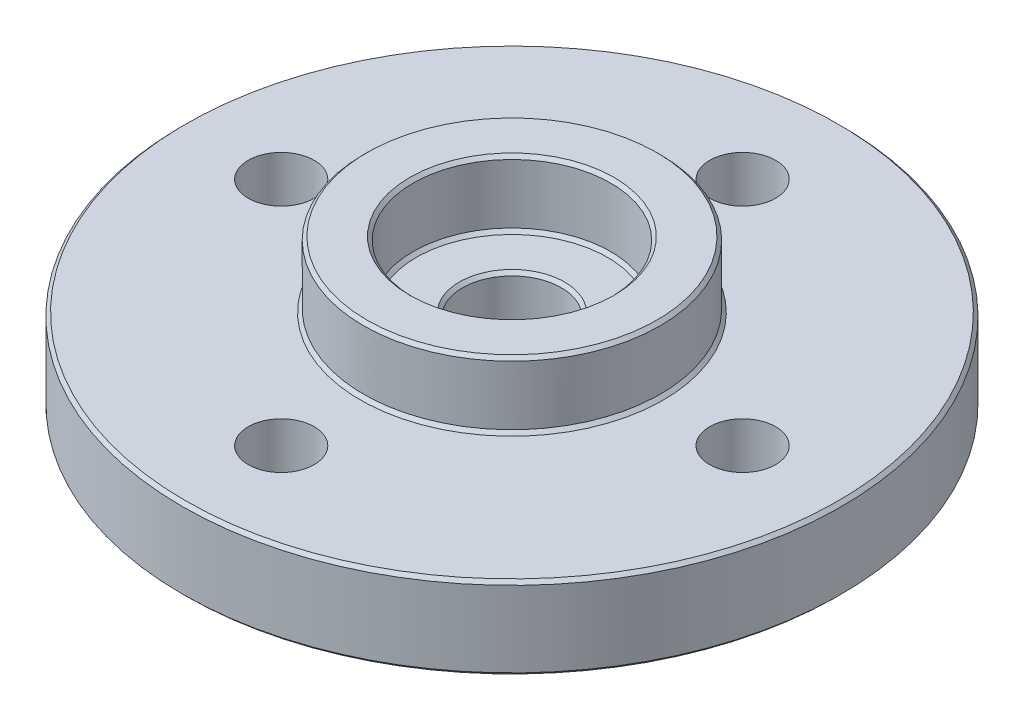
ISO-10303-21;
HEADER;
FILE_DESCRIPTION(('STEP AP214'),'2;1');
FILE_NAME('part.step','',(''),(''),'','','');
FILE_SCHEMA(('AUTOMOTIVE_DESIGN { 1 0 10303 214 1 1 1 1 }'));
ENDSEC;
DATA;
#1=APPLICATION_CONTEXT('core data for automotive mechanical design processes');
#2=APPLICATION_PROTOCOL_DEFINITION('international standard','automotive_design',2000,#1);
#3=PRODUCT_CONTEXT('',#1,'mechanical');
#4=PRODUCT('Part','Part','',(#3));
#5=PRODUCT_RELATED_PRODUCT_CATEGORY('part','',(#4));
#6=PRODUCT_DEFINITION_FORMATION('','',#4);
#7=PRODUCT_DEFINITION_CONTEXT('part definition',#1,'design');
#8=PRODUCT_DEFINITION('design','',#6,#7);
#9=PRODUCT_DEFINITION_SHAPE('','',#8);
#10=(LENGTH_UNIT() NAMED_UNIT(*) SI_UNIT(.MILLI.,.METRE.));
#11=(NAMED_UNIT(*) PLANE_ANGLE_UNIT() SI_UNIT($,.RADIAN.));
#12=(NAMED_UNIT(*) SI_UNIT($,.STERADIAN.) SOLID_ANGLE_UNIT());
#13=UNCERTAINTY_MEASURE_WITH_UNIT(LENGTH_MEASURE(1.E-05),#10,'distance_accuracy_value','');
#14=(GEOMETRIC_REPRESENTATION_CONTEXT(3) GLOBAL_UNCERTAINTY_ASSIGNED_CONTEXT((#13)) GLOBAL_UNIT_ASSIGNED_CONTEXT((#10,
#11,#12)) REPRESENTATION_CONTEXT('',''));
#15=CARTESIAN_POINT('',(0.,0.,0.));
#16=DIRECTION('',(0.,0.,1.));
#17=DIRECTION('',(1.,0.,0.));
#18=AXIS2_PLACEMENT_3D('',#15,#16,#17);
#19=CARTESIAN_POINT('',(0.,2.5,0.));
#20=DIRECTION('',(0.,1.,0.));
#21=DIRECTION('',(0.,0.,1.));
#22=AXIS2_PLACEMENT_3D('',#19,#20,#21);
#23=PLANE('',#22);
#24=CARTESIAN_POINT('',(0.,2.5,0.));
#25=DIRECTION('',(0.,1.,0.));
#26=DIRECTION('',(0.,0.,1.));
#27=AXIS2_PLACEMENT_3D('',#24,#25,#26);
#28=CIRCLE('',#27,1.6);
#29=CARTESIAN_POINT('',(0.,2.5,1.6));
#30=VERTEX_POINT('',#29);
#31=EDGE_CURVE('E56',#30,#30,#28,.F.);
#32=ORIENTED_EDGE('',*,*,#31,.T.);
#33=EDGE_LOOP('',(#32));
#34=FACE_BOUND('',#33,.T.);
#35=CARTESIAN_POINT('',(0.,2.5,0.));
#36=DIRECTION('',(0.,1.,0.));
#37=DIRECTION('',(0.,0.,1.));
#38=AXIS2_PLACEMENT_3D('',#35,#36,#37);
#39=CIRCLE('',#38,2.89999999999999);
#40=CARTESIAN_POINT('',(0.,2.5,2.89999999999999));
#41=VERTEX_POINT('',#40);
#42=EDGE_CURVE('E61',#41,#41,#39,.T.);
#43=ORIENTED_EDGE('',*,*,#42,.T.);
#44=EDGE_LOOP('',(#43));
#45=FACE_BOUND('',#44,.T.);
#46=ADVANCED_FACE('F40',(#34,#45),#23,.T.);
#47=CARTESIAN_POINT('',(0.,2.5,0.));
#48=DIRECTION('',(0.,1.,0.));
#49=DIRECTION('',(0.,0.,1.));
#50=AXIS2_PLACEMENT_3D('',#47,#48,#49);
#51=CIRCLE('',#50,9.89999999999999);
#52=CARTESIAN_POINT('',(0.,2.5,9.89999999999999));
#53=VERTEX_POINT('',#52);
#54=EDGE_CURVE('E70',#53,#53,#51,.T.);
#55=ORIENTED_EDGE('',*,*,#54,.T.);
#56=EDGE_LOOP('',(#55));
#57=FACE_BOUND('',#56,.T.);
#58=CARTESIAN_POINT('',(0.,2.5,0.));
#59=DIRECTION('',(0.,1.,0.));
#60=DIRECTION('',(0.,0.,1.));
#61=AXIS2_PLACEMENT_3D('',#58,#59,#60);
#62=CIRCLE('',#61,4.59999999999999);
#63=CARTESIAN_POINT('',(0.,2.5,-4.59999999999999));
#64=VERTEX_POINT('',#63);
#65=EDGE_CURVE('E73',#64,#64,#62,.F.);
#66=ORIENTED_EDGE('',*,*,#65,.T.);
#67=EDGE_LOOP('',(#66));
#68=FACE_BOUND('',#67,.T.);
#69=CARTESIAN_POINT('',(3.95332173747447E-13,2.5,7.));
#70=DIRECTION('',(0.,1.,0.));
#71=DIRECTION('',(0.,0.,1.));
#72=AXIS2_PLACEMENT_3D('',#69,#70,#71);
#73=CIRCLE('',#72,1.);
#74=CARTESIAN_POINT('',(3.95332173747447E-13,2.5,8.));
#75=VERTEX_POINT('',#74);
#76=EDGE_CURVE('E104',#75,#75,#73,.T.);
#77=ORIENTED_EDGE('',*,*,#76,.F.);
#78=EDGE_LOOP('',(#77));
#79=FACE_BOUND('',#78,.T.);
#80=CARTESIAN_POINT('',(0.,2.5,-7.));
#81=DIRECTION('',(0.,1.,0.));
#82=DIRECTION('',(0.,0.,1.));
#83=AXIS2_PLACEMENT_3D('',#80,#81,#82);
#84=CIRCLE('',#83,1.);
#85=CARTESIAN_POINT('',(0.,2.5,-6.));
#86=VERTEX_POINT('',#85);
#87=EDGE_CURVE('E94',#86,#86,#84,.T.);
#88=ORIENTED_EDGE('',*,*,#87,.F.);
#89=EDGE_LOOP('',(#88));
#90=FACE_BOUND('',#89,.T.);
#91=CARTESIAN_POINT('',(7.0000000000002,2.5,-1.97666086873723E-13));
#92=DIRECTION('',(0.,1.,0.));
#93=DIRECTION('',(0.,0.,1.));
#94=AXIS2_PLACEMENT_3D('',#91,#92,#93);
#95=CIRCLE('',#94,1.);
#96=CARTESIAN_POINT('',(7.0000000000002,2.5,0.999999999999803));
#97=VERTEX_POINT('',#96);
#98=EDGE_CURVE('E98',#97,#97,#95,.T.);
#99=ORIENTED_EDGE('',*,*,#98,.F.);
#100=EDGE_LOOP('',(#99));
#101=FACE_BOUND('',#100,.T.);
#102=CARTESIAN_POINT('',(-6.9999999999998,2.5,1.98523339633126E-13));
#103=DIRECTION('',(0.,1.,0.));
#104=DIRECTION('',(0.,0.,1.));
#105=AXIS2_PLACEMENT_3D('',#102,#103,#104);
#106=CIRCLE('',#105,1.);
#107=CARTESIAN_POINT('',(-6.9999999999998,2.5,1.0000000000002));
#108=VERTEX_POINT('',#107);
#109=EDGE_CURVE('E110',#108,#108,#106,.T.);
#110=ORIENTED_EDGE('',*,*,#109,.F.);
#111=EDGE_LOOP('',(#110));
#112=FACE_BOUND('',#111,.T.);
#113=ADVANCED_FACE('F122',(#57,#68,#79,#90,#101,#112),#23,.T.);
#114=CARTESIAN_POINT('',(0.,0.,0.));
#115=DIRECTION('',(0.,1.,0.));
#116=DIRECTION('',(0.,0.,1.));
#117=AXIS2_PLACEMENT_3D('',#114,#115,#116);
#118=PLANE('',#117);
#119=CARTESIAN_POINT('',(0.,0.,0.));
#120=DIRECTION('',(0.,1.,0.));
#121=DIRECTION('',(0.,0.,1.));
#122=AXIS2_PLACEMENT_3D('',#119,#120,#121);
#123=CIRCLE('',#122,9.9);
#124=CARTESIAN_POINT('',(0.,0.,9.9));
#125=VERTEX_POINT('',#124);
#126=EDGE_CURVE('E76',#125,#125,#123,.F.);
#127=ORIENTED_EDGE('',*,*,#126,.T.);
#128=EDGE_LOOP('',(#127));
#129=FACE_BOUND('',#128,.T.);
#130=CARTESIAN_POINT('',(0.,0.,0.));
#131=DIRECTION('',(0.,1.,0.));
#132=DIRECTION('',(0.,0.,1.));
#133=AXIS2_PLACEMENT_3D('',#130,#131,#132);
#134=CIRCLE('',#133,1.5);
#135=CARTESIAN_POINT('',(0.,0.,1.5));
#136=VERTEX_POINT('',#135);
#137=EDGE_CURVE('E91',#136,#136,#134,.T.);
#138=ORIENTED_EDGE('',*,*,#137,.T.);
#139=EDGE_LOOP('',(#138));
#140=FACE_BOUND('',#139,.T.);
#141=CARTESIAN_POINT('',(0.,0.,-7.));
#142=DIRECTION('',(0.,1.,0.));
#143=DIRECTION('',(0.,0.,1.));
#144=AXIS2_PLACEMENT_3D('',#141,#142,#143);
#145=CIRCLE('',#144,1.);
#146=CARTESIAN_POINT('',(0.,0.,-6.));
#147=VERTEX_POINT('',#146);
#148=EDGE_CURVE('E95',#147,#147,#145,.T.);
#149=ORIENTED_EDGE('',*,*,#148,.T.);
#150=EDGE_LOOP('',(#149));
#151=FACE_BOUND('',#150,.T.);
#152=CARTESIAN_POINT('',(7.0000000000002,0.,-1.97666086873723E-13));
#153=DIRECTION('',(0.,1.,0.));
#154=DIRECTION('',(0.,0.,1.));
#155=AXIS2_PLACEMENT_3D('',#152,#153,#154);
#156=CIRCLE('',#155,1.);
#157=CARTESIAN_POINT('',(7.0000000000002,0.,0.999999999999803));
#158=VERTEX_POINT('',#157);
#159=EDGE_CURVE('E101',#158,#158,#156,.T.);
#160=ORIENTED_EDGE('',*,*,#159,.T.);
#161=EDGE_LOOP('',(#160));
#162=FACE_BOUND('',#161,.T.);
#163=CARTESIAN_POINT('',(3.95332173747447E-13,0.,7.));
#164=DIRECTION('',(0.,1.,0.));
#165=DIRECTION('',(0.,0.,1.));
#166=AXIS2_PLACEMENT_3D('',#163,#164,#165);
#167=CIRCLE('',#166,1.);
#168=CARTESIAN_POINT('',(3.95332173747447E-13,0.,8.));
#169=VERTEX_POINT('',#168);
#170=EDGE_CURVE('E107',#169,#169,#167,.T.);
#171=ORIENTED_EDGE('',*,*,#170,.T.);
#172=EDGE_LOOP('',(#171));
#173=FACE_BOUND('',#172,.T.);
#174=CARTESIAN_POINT('',(-6.9999999999998,0.,1.98523339633126E-13));
#175=DIRECTION('',(0.,1.,0.));
#176=DIRECTION('',(0.,0.,1.));
#177=AXIS2_PLACEMENT_3D('',#174,#175,#176);
#178=CIRCLE('',#177,1.);
#179=CARTESIAN_POINT('',(-6.9999999999998,0.,1.0000000000002));
#180=VERTEX_POINT('',#179);
#181=EDGE_CURVE('E113',#180,#180,#178,.T.);
#182=ORIENTED_EDGE('',*,*,#181,.T.);
#183=EDGE_LOOP('',(#182));
#184=FACE_BOUND('',#183,.T.);
#185=ADVANCED_FACE('F124',(#129,#140,#151,#162,#173,#184),#118,.F.);
#186=CARTESIAN_POINT('',(0.,2.5,0.));
#187=DIRECTION('',(0.,-1.,0.));
#188=DIRECTION('',(0.,0.,-1.));
#189=AXIS2_PLACEMENT_3D('',#186,#187,#188);
#190=CYLINDRICAL_SURFACE('',#189,9.99999999999999);
#191=CARTESIAN_POINT('',(0.,0.0999999999999959,0.));
#192=DIRECTION('',(0.,1.,0.));
#193=DIRECTION('',(0.,0.,1.));
#194=AXIS2_PLACEMENT_3D('',#191,#192,#193);
#195=CIRCLE('',#194,9.99999999999999);
#196=CARTESIAN_POINT('',(0.,0.0999999999999959,9.99999999999999));
#197=VERTEX_POINT('',#196);
#198=EDGE_CURVE('E79',#197,#197,#195,.T.);
#199=ORIENTED_EDGE('',*,*,#198,.T.);
#200=EDGE_LOOP('',(#199));
#201=FACE_BOUND('',#200,.T.);
#202=CARTESIAN_POINT('',(0.,2.4,0.));
#203=DIRECTION('',(0.,1.,0.));
#204=DIRECTION('',(0.,0.,1.));
#205=AXIS2_PLACEMENT_3D('',#202,#203,#204);
#206=CIRCLE('',#205,9.99999999999999);
#207=CARTESIAN_POINT('',(0.,2.4,9.99999999999999));
#208=VERTEX_POINT('',#207);
#209=EDGE_CURVE('E82',#208,#208,#206,.F.);
#210=ORIENTED_EDGE('',*,*,#209,.T.);
#211=EDGE_LOOP('',(#210));
#212=FACE_BOUND('',#211,.T.);
#213=ADVANCED_FACE('F131',(#201,#212),#190,.T.);
#214=CARTESIAN_POINT('',(0.,2.5,0.));
#215=DIRECTION('',(0.,-1.,0.));
#216=DIRECTION('',(0.,0.,-1.));
#217=AXIS2_PLACEMENT_3D('',#214,#215,#216);
#218=CYLINDRICAL_SURFACE('',#217,1.5);
#219=CARTESIAN_POINT('',(0.,2.4,0.));
#220=DIRECTION('',(0.,1.,0.));
#221=DIRECTION('',(0.,0.,1.));
#222=AXIS2_PLACEMENT_3D('',#219,#220,#221);
#223=CIRCLE('',#222,1.5);
#224=CARTESIAN_POINT('',(0.,2.4,1.5));
#225=VERTEX_POINT('',#224);
#226=EDGE_CURVE('E64',#225,#225,#223,.T.);
#227=ORIENTED_EDGE('',*,*,#226,.T.);
#228=EDGE_LOOP('',(#227));
#229=FACE_BOUND('',#228,.T.);
#230=ORIENTED_EDGE('',*,*,#137,.F.);
#231=EDGE_LOOP('',(#230));
#232=FACE_BOUND('',#231,.T.);
#233=ADVANCED_FACE('F137',(#229,#232),#218,.F.);
#234=CARTESIAN_POINT('',(0.,2.5,-7.));
#235=DIRECTION('',(0.,-1.,0.));
#236=DIRECTION('',(0.,0.,-1.));
#237=AXIS2_PLACEMENT_3D('',#234,#235,#236);
#238=CYLINDRICAL_SURFACE('',#237,1.);
#239=ORIENTED_EDGE('',*,*,#87,.T.);
#240=EDGE_LOOP('',(#239));
#241=FACE_BOUND('',#240,.T.);
#242=ORIENTED_EDGE('',*,*,#148,.F.);
#243=EDGE_LOOP('',(#242));
#244=FACE_BOUND('',#243,.T.);
#245=ADVANCED_FACE('F216',(#241,#244),#238,.F.);
#246=CARTESIAN_POINT('',(7.0000000000002,2.5,-1.97666086873723E-13));
#247=DIRECTION('',(0.,-1.,0.));
#248=DIRECTION('',(0.,0.,-1.));
#249=AXIS2_PLACEMENT_3D('',#246,#247,#248);
#250=CYLINDRICAL_SURFACE('',#249,1.);
#251=ORIENTED_EDGE('',*,*,#98,.T.);
#252=EDGE_LOOP('',(#251));
#253=FACE_BOUND('',#252,.T.);
#254=ORIENTED_EDGE('',*,*,#159,.F.);
#255=EDGE_LOOP('',(#254));
#256=FACE_BOUND('',#255,.T.);
#257=ADVANCED_FACE('F213',(#253,#256),#250,.F.);
#258=CARTESIAN_POINT('',(3.95332173747447E-13,2.5,7.));
#259=DIRECTION('',(0.,-1.,0.));
#260=DIRECTION('',(0.,0.,-1.));
#261=AXIS2_PLACEMENT_3D('',#258,#259,#260);
#262=CYLINDRICAL_SURFACE('',#261,1.);
#263=ORIENTED_EDGE('',*,*,#76,.T.);
#264=EDGE_LOOP('',(#263));
#265=FACE_BOUND('',#264,.T.);
#266=ORIENTED_EDGE('',*,*,#170,.F.);
#267=EDGE_LOOP('',(#266));
#268=FACE_BOUND('',#267,.T.);
#269=ADVANCED_FACE('F210',(#265,#268),#262,.F.);
#270=CARTESIAN_POINT('',(-6.9999999999998,2.5,1.98523339633126E-13));
#271=DIRECTION('',(0.,-1.,0.));
#272=DIRECTION('',(0.,0.,-1.));
#273=AXIS2_PLACEMENT_3D('',#270,#271,#272);
#274=CYLINDRICAL_SURFACE('',#273,1.);
#275=ORIENTED_EDGE('',*,*,#109,.T.);
#276=EDGE_LOOP('',(#275));
#277=FACE_BOUND('',#276,.T.);
#278=ORIENTED_EDGE('',*,*,#181,.F.);
#279=EDGE_LOOP('',(#278));
#280=FACE_BOUND('',#279,.T.);
#281=ADVANCED_FACE('F119',(#277,#280),#274,.F.);
#282=CARTESIAN_POINT('',(0.,4.5,0.));
#283=DIRECTION('',(0.,1.,0.));
#284=DIRECTION('',(0.,0.,1.));
#285=AXIS2_PLACEMENT_3D('',#282,#283,#284);
#286=PLANE('',#285);
#287=CARTESIAN_POINT('',(0.,4.5,0.));
#288=DIRECTION('',(0.,1.,0.));
#289=DIRECTION('',(0.,0.,1.));
#290=AXIS2_PLACEMENT_3D('',#287,#288,#289);
#291=CIRCLE('',#290,3.10000000000001);
#292=CARTESIAN_POINT('',(0.,4.5,3.10000000000001));
#293=VERTEX_POINT('',#292);
#294=EDGE_CURVE('E10',#293,#293,#291,.F.);
#295=ORIENTED_EDGE('',*,*,#294,.T.);
#296=EDGE_LOOP('',(#295));
#297=FACE_BOUND('',#296,.T.);
#298=CARTESIAN_POINT('',(0.,4.5,0.));
#299=DIRECTION('',(0.,1.,0.));
#300=DIRECTION('',(0.,0.,1.));
#301=AXIS2_PLACEMENT_3D('',#298,#299,#300);
#302=CIRCLE('',#301,4.4);
#303=CARTESIAN_POINT('',(0.,4.5,4.4));
#304=VERTEX_POINT('',#303);
#305=EDGE_CURVE('E88',#304,#304,#302,.T.);
#306=ORIENTED_EDGE('',*,*,#305,.T.);
#307=EDGE_LOOP('',(#306));
#308=FACE_BOUND('',#307,.T.);
#309=ADVANCED_FACE('F202',(#297,#308),#286,.T.);
#310=CARTESIAN_POINT('',(0.,4.5,0.));
#311=DIRECTION('',(0.,-1.,0.));
#312=DIRECTION('',(0.,0.,-1.));
#313=AXIS2_PLACEMENT_3D('',#310,#311,#312);
#314=CYLINDRICAL_SURFACE('',#313,4.5);
#315=CARTESIAN_POINT('',(0.,2.6,0.));
#316=DIRECTION('',(0.,1.,0.));
#317=DIRECTION('',(0.,0.,1.));
#318=AXIS2_PLACEMENT_3D('',#315,#316,#317);
#319=CIRCLE('',#318,4.5);
#320=CARTESIAN_POINT('',(0.,2.6,-4.5));
#321=VERTEX_POINT('',#320);
#322=EDGE_CURVE('E67',#321,#321,#319,.T.);
#323=ORIENTED_EDGE('',*,*,#322,.T.);
#324=EDGE_LOOP('',(#323));
#325=FACE_BOUND('',#324,.T.);
#326=CARTESIAN_POINT('',(0.,4.40000000000001,0.));
#327=DIRECTION('',(0.,1.,0.));
#328=DIRECTION('',(0.,0.,1.));
#329=AXIS2_PLACEMENT_3D('',#326,#327,#328);
#330=CIRCLE('',#329,4.5);
#331=CARTESIAN_POINT('',(0.,4.40000000000001,4.5));
#332=VERTEX_POINT('',#331);
#333=EDGE_CURVE('E85',#332,#332,#330,.F.);
#334=ORIENTED_EDGE('',*,*,#333,.T.);
#335=EDGE_LOOP('',(#334));
#336=FACE_BOUND('',#335,.T.);
#337=ADVANCED_FACE('F197',(#325,#336),#314,.T.);
#338=CARTESIAN_POINT('',(0.,4.5,0.));
#339=DIRECTION('',(0.,-1.,0.));
#340=DIRECTION('',(0.,0.,-1.));
#341=AXIS2_PLACEMENT_3D('',#338,#339,#340);
#342=CYLINDRICAL_SURFACE('',#341,3.);
#343=CARTESIAN_POINT('',(0.,2.60000000000001,0.));
#344=DIRECTION('',(0.,1.,0.));
#345=DIRECTION('',(0.,0.,1.));
#346=AXIS2_PLACEMENT_3D('',#343,#344,#345);
#347=CIRCLE('',#346,3.);
#348=CARTESIAN_POINT('',(0.,2.60000000000001,3.));
#349=VERTEX_POINT('',#348);
#350=EDGE_CURVE('E48',#349,#349,#347,.F.);
#351=ORIENTED_EDGE('',*,*,#350,.T.);
#352=EDGE_LOOP('',(#351));
#353=FACE_BOUND('',#352,.T.);
#354=CARTESIAN_POINT('',(0.,4.39999999999999,0.));
#355=DIRECTION('',(0.,1.,0.));
#356=DIRECTION('',(0.,0.,1.));
#357=AXIS2_PLACEMENT_3D('',#354,#355,#356);
#358=CIRCLE('',#357,3.);
#359=CARTESIAN_POINT('',(0.,4.39999999999999,3.));
#360=VERTEX_POINT('',#359);
#361=EDGE_CURVE('E52',#360,#360,#358,.T.);
#362=ORIENTED_EDGE('',*,*,#361,.T.);
#363=EDGE_LOOP('',(#362));
#364=FACE_BOUND('',#363,.T.);
#365=ADVANCED_FACE('F151',(#353,#364),#342,.F.);
#366=CARTESIAN_POINT('',(0.,4.5,0.));
#367=DIRECTION('',(0.,-1.,0.));
#368=DIRECTION('',(0.,0.,-1.));
#369=AXIS2_PLACEMENT_3D('',#366,#367,#368);
#370=CONICAL_SURFACE('',#369,4.4,0.785398163397474);
#371=ORIENTED_EDGE('',*,*,#333,.F.);
#372=EDGE_LOOP('',(#371));
#373=FACE_BOUND('',#372,.T.);
#374=ORIENTED_EDGE('',*,*,#305,.F.);
#375=EDGE_LOOP('',(#374));
#376=FACE_BOUND('',#375,.T.);
#377=ADVANCED_FACE('F144',(#373,#376),#370,.T.);
#378=CARTESIAN_POINT('',(0.,0.0999999999999959,0.));
#379=DIRECTION('',(0.,1.,0.));
#380=DIRECTION('',(0.,0.,1.));
#381=AXIS2_PLACEMENT_3D('',#378,#379,#380);
#382=CONICAL_SURFACE('',#381,9.99999999999999,0.785398163397457);
#383=ORIENTED_EDGE('',*,*,#126,.F.);
#384=EDGE_LOOP('',(#383));
#385=FACE_BOUND('',#384,.T.);
#386=ORIENTED_EDGE('',*,*,#198,.F.);
#387=EDGE_LOOP('',(#386));
#388=FACE_BOUND('',#387,.T.);
#389=ADVANCED_FACE('F150',(#385,#388),#382,.T.);
#390=CARTESIAN_POINT('',(0.,2.5,0.));
#391=DIRECTION('',(0.,-1.,0.));
#392=DIRECTION('',(0.,0.,-1.));
#393=AXIS2_PLACEMENT_3D('',#390,#391,#392);
#394=CONICAL_SURFACE('',#393,9.89999999999999,0.785398163397466);
#395=ORIENTED_EDGE('',*,*,#209,.F.);
#396=EDGE_LOOP('',(#395));
#397=FACE_BOUND('',#396,.T.);
#398=ORIENTED_EDGE('',*,*,#54,.F.);
#399=EDGE_LOOP('',(#398));
#400=FACE_BOUND('',#399,.T.);
#401=ADVANCED_FACE('F158',(#397,#400),#394,.T.);
#402=CARTESIAN_POINT('',(0.,2.6,0.));
#403=DIRECTION('',(0.,-1.,0.));
#404=DIRECTION('',(0.,0.,-1.));
#405=AXIS2_PLACEMENT_3D('',#402,#403,#404);
#406=CONICAL_SURFACE('',#405,4.5,0.785398163397431);
#407=CARTESIAN_POINT('',(0.,2.5,-4.59999999999999));
#408=CARTESIAN_POINT('',(0.,2.50104166666667,-4.59895833333333));
#409=CARTESIAN_POINT('',(0.,2.50208333333333,-4.59791666666666));
#410=CARTESIAN_POINT('',(0.,2.50416666666667,-4.59583333333333));
#411=CARTESIAN_POINT('',(0.,2.50520833333333,-4.59479166666666));
#412=CARTESIAN_POINT('',(0.,2.50729166666667,-4.59270833333333));
#413=CARTESIAN_POINT('',(0.,2.50833333333333,-4.59166666666666));
#414=CARTESIAN_POINT('',(0.,2.51041666666667,-4.58958333333333));
#415=CARTESIAN_POINT('',(0.,2.51145833333333,-4.58854166666666));
#416=CARTESIAN_POINT('',(0.,2.51354166666667,-4.58645833333333));
#417=CARTESIAN_POINT('',(0.,2.51458333333333,-4.58541666666666));
#418=CARTESIAN_POINT('',(0.,2.51666666666667,-4.58333333333333));
#419=CARTESIAN_POINT('',(0.,2.51770833333333,-4.58229166666666));
#420=CARTESIAN_POINT('',(0.,2.51979166666667,-4.58020833333333));
#421=CARTESIAN_POINT('',(0.,2.52083333333333,-4.57916666666666));
#422=CARTESIAN_POINT('',(0.,2.52291666666667,-4.57708333333333));
#423=CARTESIAN_POINT('',(0.,2.52395833333333,-4.57604166666666));
#424=CARTESIAN_POINT('',(0.,2.52604166666667,-4.57395833333333));
#425=CARTESIAN_POINT('',(0.,2.52708333333333,-4.57291666666666));
#426=CARTESIAN_POINT('',(0.,2.52916666666667,-4.57083333333333));
#427=CARTESIAN_POINT('',(0.,2.53020833333333,-4.56979166666666));
#428=CARTESIAN_POINT('',(0.,2.53229166666667,-4.56770833333333));
#429=CARTESIAN_POINT('',(0.,2.53333333333333,-4.56666666666666));
#430=CARTESIAN_POINT('',(0.,2.53541666666667,-4.56458333333333));
#431=CARTESIAN_POINT('',(0.,2.53645833333333,-4.56354166666666));
#432=CARTESIAN_POINT('',(0.,2.53854166666666,-4.56145833333333));
#433=CARTESIAN_POINT('',(0.,2.53958333333333,-4.56041666666666));
#434=CARTESIAN_POINT('',(0.,2.54166666666667,-4.55833333333333));
#435=CARTESIAN_POINT('',(0.,2.54270833333333,-4.55729166666666));
#436=CARTESIAN_POINT('',(0.,2.54479166666667,-4.55520833333333));
#437=CARTESIAN_POINT('',(0.,2.54583333333333,-4.55416666666666));
#438=CARTESIAN_POINT('',(0.,2.54791666666666,-4.55208333333333));
#439=CARTESIAN_POINT('',(0.,2.54895833333333,-4.55104166666666));
#440=CARTESIAN_POINT('',(0.,2.55104166666667,-4.54895833333333));
#441=CARTESIAN_POINT('',(0.,2.55208333333333,-4.54791666666666));
#442=CARTESIAN_POINT('',(0.,2.55416666666666,-4.54583333333333));
#443=CARTESIAN_POINT('',(0.,2.55520833333333,-4.54479166666666));
#444=CARTESIAN_POINT('',(0.,2.55729166666666,-4.54270833333333));
#445=CARTESIAN_POINT('',(0.,2.55833333333333,-4.54166666666666));
#446=CARTESIAN_POINT('',(0.,2.56041666666666,-4.53958333333333));
#447=CARTESIAN_POINT('',(0.,2.56145833333333,-4.53854166666666));
#448=CARTESIAN_POINT('',(0.,2.56354166666666,-4.53645833333333));
#449=CARTESIAN_POINT('',(0.,2.56458333333333,-4.53541666666666));
#450=CARTESIAN_POINT('',(0.,2.56666666666666,-4.53333333333333));
#451=CARTESIAN_POINT('',(0.,2.56770833333333,-4.53229166666666));
#452=CARTESIAN_POINT('',(0.,2.56979166666666,-4.53020833333333));
#453=CARTESIAN_POINT('',(0.,2.57083333333333,-4.52916666666667));
#454=CARTESIAN_POINT('',(0.,2.57291666666666,-4.52708333333333));
#455=CARTESIAN_POINT('',(0.,2.57395833333333,-4.52604166666666));
#456=CARTESIAN_POINT('',(0.,2.57604166666666,-4.52395833333333));
#457=CARTESIAN_POINT('',(0.,2.57708333333333,-4.52291666666666));
#458=CARTESIAN_POINT('',(0.,2.57916666666666,-4.52083333333333));
#459=CARTESIAN_POINT('',(0.,2.58020833333333,-4.51979166666666));
#460=CARTESIAN_POINT('',(0.,2.58229166666666,-4.51770833333333));
#461=CARTESIAN_POINT('',(0.,2.58333333333333,-4.51666666666667));
#462=CARTESIAN_POINT('',(0.,2.58541666666666,-4.51458333333333));
#463=CARTESIAN_POINT('',(0.,2.58645833333333,-4.51354166666667));
#464=CARTESIAN_POINT('',(0.,2.58854166666666,-4.51145833333333));
#465=CARTESIAN_POINT('',(0.,2.58958333333333,-4.51041666666667));
#466=CARTESIAN_POINT('',(0.,2.59166666666666,-4.50833333333333));
#467=CARTESIAN_POINT('',(0.,2.59270833333333,-4.50729166666667));
#468=CARTESIAN_POINT('',(0.,2.59479166666666,-4.50520833333333));
#469=CARTESIAN_POINT('',(0.,2.59583333333333,-4.50416666666667));
#470=CARTESIAN_POINT('',(0.,2.59791666666666,-4.50208333333333));
#471=CARTESIAN_POINT('',(0.,2.59895833333333,-4.50104166666667));
#472=CARTESIAN_POINT('',(0.,2.6,-4.5));
#473=B_SPLINE_CURVE_WITH_KNOTS('',3,(#407,#408,#409,#410,#411,#412,#413,#414,#415,#416,#417,
#418,#419,#420,#421,#422,#423,#424,#425,#426,#427,#428,#429,#430,#431,#432,#433,#434,#435,#436,
#437,#438,#439,#440,#441,#442,#443,#444,#445,#446,#447,#448,#449,#450,#451,#452,#453,#454,#455,
#456,#457,#458,#459,#460,#461,#462,#463,#464,#465,#466,#467,#468,#469,#470,#471,#472),
.UNSPECIFIED.,.F.,.F.,(4,2,2,2,2,2,2,2,2,2,2,2,2,2,2,2,2,2,2,2,2,2,2,2,2,2,2,2,2,2,2,2,4),(0.,
0.00441941738241544,0.00883883476483118,0.0132582521472466,0.0176776695296624,
0.0220970869120784,0.0265165042944941,0.0309359216769096,0.0353553390593253,0.0397747564417411,
0.0441941738241565,0.0486135912065722,0.0530330085889883,0.057452425971404,0.0618718433538195,
0.0662912607362352,0.0707106781186509,0.0751300955010664,0.0795495128834827,0.0839689302658982,
0.0883883476483139,0.0928077650307294,0.0972271824131451,0.101646599795561,0.106066017177977,
0.110485434560393,0.114904851942808,0.119324269325224,0.123743686707639,0.128163104090055,
0.13258252147247,0.137001938854887,0.141421356237303),.UNSPECIFIED.);
#474=EDGE_CURVE('BSEAM165',#64,#321,#473,.T.);
#475=ORIENTED_EDGE('',*,*,#65,.F.);
#476=ORIENTED_EDGE('',*,*,#322,.F.);
#477=ORIENTED_EDGE('',*,*,#474,.T.);
#478=ORIENTED_EDGE('',*,*,#474,.F.);
#479=EDGE_LOOP('',(#475,#477,#476,#478));
#480=FACE_BOUND('',#479,.T.);
#481=ADVANCED_FACE('F165',(#480),#406,.T.);
#482=CARTESIAN_POINT('',(0.,2.4,0.));
#483=DIRECTION('',(0.,1.,0.));
#484=DIRECTION('',(0.,0.,1.));
#485=AXIS2_PLACEMENT_3D('',#482,#483,#484);
#486=CONICAL_SURFACE('',#485,1.5,0.785398163397458);
#487=ORIENTED_EDGE('',*,*,#31,.F.);
#488=EDGE_LOOP('',(#487));
#489=FACE_BOUND('',#488,.T.);
#490=ORIENTED_EDGE('',*,*,#226,.F.);
#491=EDGE_LOOP('',(#490));
#492=FACE_BOUND('',#491,.T.);
#493=ADVANCED_FACE('F172',(#489,#492),#486,.F.);
#494=CARTESIAN_POINT('',(0.,2.5,0.));
#495=DIRECTION('',(0.,1.,0.));
#496=DIRECTION('',(0.,0.,1.));
#497=AXIS2_PLACEMENT_3D('',#494,#495,#496);
#498=CONICAL_SURFACE('',#497,2.89999999999999,0.785398163397457);
#499=ORIENTED_EDGE('',*,*,#350,.F.);
#500=EDGE_LOOP('',(#499));
#501=FACE_BOUND('',#500,.T.);
#502=ORIENTED_EDGE('',*,*,#42,.F.);
#503=EDGE_LOOP('',(#502));
#504=FACE_BOUND('',#503,.T.);
#505=ADVANCED_FACE('F178',(#501,#504),#498,.F.);
#506=CARTESIAN_POINT('',(0.,4.39999999999999,0.));
#507=DIRECTION('',(0.,1.,0.));
#508=DIRECTION('',(0.,0.,1.));
#509=AXIS2_PLACEMENT_3D('',#506,#507,#508);
#510=CONICAL_SURFACE('',#509,3.,0.785398163397459);
#511=ORIENTED_EDGE('',*,*,#294,.F.);
#512=EDGE_LOOP('',(#511));
#513=FACE_BOUND('',#512,.T.);
#514=ORIENTED_EDGE('',*,*,#361,.F.);
#515=EDGE_LOOP('',(#514));
#516=FACE_BOUND('',#515,.T.);
#517=ADVANCED_FACE('F43',(#513,#516),#510,.F.);
#518=CLOSED_SHELL('',(#46,#113,#185,#213,#233,#245,#257,#269,#281,#309,#337,#365,#377,#389,#401,
#481,#493,#505,#517));
#519=MANIFOLD_SOLID_BREP('B2',#518);
#520=ADVANCED_BREP_SHAPE_REPRESENTATION('',(#18,#519),#14);
#521=SHAPE_DEFINITION_REPRESENTATION(#9,#520);
ENDSEC;
END-ISO-10303-21;
